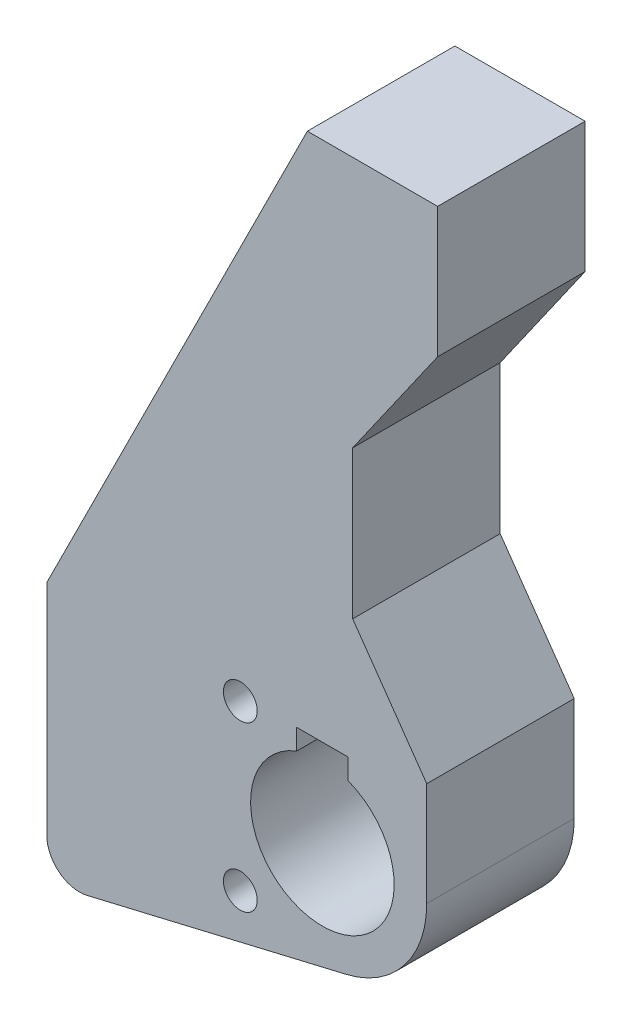
ISO-10303-21;
HEADER;
FILE_DESCRIPTION(('STEP AP214'),'2;1');
FILE_NAME('part.step','',(''),(''),'','','');
FILE_SCHEMA(('AUTOMOTIVE_DESIGN { 1 0 10303 214 1 1 1 1 }'));
ENDSEC;
DATA;
#1=APPLICATION_CONTEXT('core data for automotive mechanical design processes');
#2=APPLICATION_PROTOCOL_DEFINITION('international standard','automotive_design',2000,#1);
#3=PRODUCT_CONTEXT('',#1,'mechanical');
#4=PRODUCT('Part','Part','',(#3));
#5=PRODUCT_RELATED_PRODUCT_CATEGORY('part','',(#4));
#6=PRODUCT_DEFINITION_FORMATION('','',#4);
#7=PRODUCT_DEFINITION_CONTEXT('part definition',#1,'design');
#8=PRODUCT_DEFINITION('design','',#6,#7);
#9=PRODUCT_DEFINITION_SHAPE('','',#8);
#10=(LENGTH_UNIT() NAMED_UNIT(*) SI_UNIT(.MILLI.,.METRE.));
#11=(NAMED_UNIT(*) PLANE_ANGLE_UNIT() SI_UNIT($,.RADIAN.));
#12=(NAMED_UNIT(*) SI_UNIT($,.STERADIAN.) SOLID_ANGLE_UNIT());
#13=UNCERTAINTY_MEASURE_WITH_UNIT(LENGTH_MEASURE(1.E-05),#10,'distance_accuracy_value','');
#14=(GEOMETRIC_REPRESENTATION_CONTEXT(3) GLOBAL_UNCERTAINTY_ASSIGNED_CONTEXT((#13)) GLOBAL_UNIT_ASSIGNED_CONTEXT((#10,
#11,#12)) REPRESENTATION_CONTEXT('',''));
#15=CARTESIAN_POINT('',(0.,0.,0.));
#16=DIRECTION('',(0.,0.,1.));
#17=DIRECTION('',(1.,0.,0.));
#18=AXIS2_PLACEMENT_3D('',#15,#16,#17);
#19=CARTESIAN_POINT('',(3.20727479697018,2.24575798994857,7.1906257));
#20=DIRECTION('',(0.819152044288988,0.573576436351051,0.));
#21=DIRECTION('',(-0.573576436351051,0.819152044288988,0.));
#22=AXIS2_PLACEMENT_3D('',#19,#20,#21);
#23=PLANE('',#22);
#24=DIRECTION('',(0.573576436351051,-0.819152044288988,0.));
#25=VECTOR('',#24,1.);
#26=CARTESIAN_POINT('',(3.20727479697018,2.24575798994857,7.1906257));
#27=LINE('',#26,#25);
#28=CARTESIAN_POINT('',(-21.2885718110109,37.2294524965969,7.1906257));
#29=VERTEX_POINT('',#28);
#30=CARTESIAN_POINT('',(-14.068,26.9174072571635,7.1906257));
#31=VERTEX_POINT('',#30);
#32=EDGE_CURVE('E213',#29,#31,#27,.T.);
#33=ORIENTED_EDGE('',*,*,#32,.T.);
#34=DIRECTION('',(0.,0.,1.));
#35=VECTOR('',#34,1.);
#36=CARTESIAN_POINT('',(-14.068,26.9174072571635,-7.1906257));
#37=LINE('',#36,#35);
#38=CARTESIAN_POINT('',(-14.068,26.9174072571635,-7.1906257));
#39=VERTEX_POINT('',#38);
#40=EDGE_CURVE('E187',#39,#31,#37,.T.);
#41=ORIENTED_EDGE('',*,*,#40,.F.);
#42=DIRECTION('',(0.573576436351051,-0.819152044288988,0.));
#43=VECTOR('',#42,1.);
#44=CARTESIAN_POINT('',(3.20727479697018,2.24575798994857,-7.1906257));
#45=LINE('',#44,#43);
#46=CARTESIAN_POINT('',(-21.2885718110109,37.2294524965969,-7.1906257));
#47=VERTEX_POINT('',#46);
#48=EDGE_CURVE('E249',#47,#39,#45,.T.);
#49=ORIENTED_EDGE('',*,*,#48,.F.);
#50=DIRECTION('',(0.,0.,-1.));
#51=VECTOR('',#50,1.);
#52=CARTESIAN_POINT('',(-21.2885718110109,37.2294524965969,7.1906257));
#53=LINE('',#52,#51);
#54=EDGE_CURVE('E282',#29,#47,#53,.T.);
#55=ORIENTED_EDGE('',*,*,#54,.F.);
#56=EDGE_LOOP('',(#33,#41,#49,#55));
#57=FACE_BOUND('',#56,.T.);
#58=ADVANCED_FACE('F71',(#57),#23,.T.);
#59=CARTESIAN_POINT('',(0.,0.,-7.1906257));
#60=DIRECTION('',(0.,0.,1.));
#61=DIRECTION('',(1.,0.,0.));
#62=AXIS2_PLACEMENT_3D('',#59,#60,#61);
#63=PLANE('',#62);
#64=DIRECTION('',(0.,-1.,0.));
#65=VECTOR('',#64,1.);
#66=CARTESIAN_POINT('',(-21.743,0.,-7.1906257));
#67=LINE('',#66,#65);
#68=CARTESIAN_POINT('',(-21.743,25.338348415311,-7.1906257));
#69=VERTEX_POINT('',#68);
#70=CARTESIAN_POINT('',(-21.743,23.338348415311,-7.1906257));
#71=VERTEX_POINT('',#70);
#72=EDGE_CURVE('E268',#69,#71,#67,.T.);
#73=ORIENTED_EDGE('',*,*,#72,.F.);
#74=DIRECTION('',(-1.,0.,0.));
#75=VECTOR('',#74,1.);
#76=CARTESIAN_POINT('',(0.,25.338348415311,-7.1906257));
#77=LINE('',#76,#75);
#78=CARTESIAN_POINT('',(-26.743,25.338348415311,-7.1906257));
#79=VERTEX_POINT('',#78);
#80=EDGE_CURVE('E210',#69,#79,#77,.T.);
#81=ORIENTED_EDGE('',*,*,#80,.T.);
#82=DIRECTION('',(0.,-1.,0.));
#83=VECTOR('',#82,1.);
#84=CARTESIAN_POINT('',(-26.743,0.,-7.1906257));
#85=LINE('',#84,#83);
#86=CARTESIAN_POINT('',(-26.743,23.338348415311,-7.1906257));
#87=VERTEX_POINT('',#86);
#88=EDGE_CURVE('E274',#79,#87,#85,.T.);
#89=ORIENTED_EDGE('',*,*,#88,.T.);
#90=CARTESIAN_POINT('',(-24.243,16.8,-7.1906257));
#91=DIRECTION('',(0.,0.,1.));
#92=DIRECTION('',(1.,0.,0.));
#93=AXIS2_PLACEMENT_3D('',#90,#91,#92);
#94=CIRCLE('',#93,7.);
#95=EDGE_CURVE('E271',#71,#87,#94,.F.);
#96=ORIENTED_EDGE('',*,*,#95,.F.);
#97=EDGE_LOOP('',(#73,#81,#89,#96));
#98=FACE_BOUND('',#97,.T.);
#99=CARTESIAN_POINT('',(-32.243,8.80000000000001,-7.1906257));
#100=DIRECTION('',(0.,0.,1.));
#101=DIRECTION('',(1.,0.,0.));
#102=AXIS2_PLACEMENT_3D('',#99,#100,#101);
#103=CIRCLE('',#102,1.65);
#104=CARTESIAN_POINT('',(-33.893,8.80000000000001,-7.1906257));
#105=VERTEX_POINT('',#104);
#106=EDGE_CURVE('E246',#105,#105,#103,.T.);
#107=ORIENTED_EDGE('',*,*,#106,.T.);
#108=EDGE_LOOP('',(#107));
#109=FACE_BOUND('',#108,.T.);
#110=CARTESIAN_POINT('',(-32.243,24.8,-7.1906257));
#111=DIRECTION('',(0.,0.,1.));
#112=DIRECTION('',(1.,0.,0.));
#113=AXIS2_PLACEMENT_3D('',#110,#111,#112);
#114=CIRCLE('',#113,1.65);
#115=CARTESIAN_POINT('',(-33.893,24.8,-7.1906257));
#116=VERTEX_POINT('',#115);
#117=EDGE_CURVE('E204',#116,#116,#114,.F.);
#118=ORIENTED_EDGE('',*,*,#117,.F.);
#119=EDGE_LOOP('',(#118));
#120=FACE_BOUND('',#119,.T.);
#121=DIRECTION('',(-0.973219537638035,-0.229877644758268,0.));
#122=VECTOR('',#121,1.);
#123=CARTESIAN_POINT('',(-2.70060532321958,11.4333947816909,-7.1906257));
#124=LINE('',#123,#122);
#125=CARTESIAN_POINT('',(-21.9039949645846,6.897491204533,-7.1906257));
#126=VERTEX_POINT('',#125);
#127=CARTESIAN_POINT('',(-47.2006384778925,0.922341090672931,-7.1906257));
#128=VERTEX_POINT('',#127);
#129=EDGE_CURVE('E191',#126,#128,#124,.T.);
#130=ORIENTED_EDGE('',*,*,#129,.T.);
#131=CARTESIAN_POINT('',(-47.9305,4.01231312267369,-7.1906257));
#132=DIRECTION('',(0.,0.,1.));
#133=DIRECTION('',(1.,0.,0.));
#134=AXIS2_PLACEMENT_3D('',#131,#132,#133);
#135=CIRCLE('',#134,3.175);
#136=CARTESIAN_POINT('',(-51.1055,4.01231312267369,-7.1906257));
#137=VERTEX_POINT('',#136);
#138=EDGE_CURVE('E93',#128,#137,#135,.F.);
#139=ORIENTED_EDGE('',*,*,#138,.T.);
#140=DIRECTION('',(0.,1.,0.));
#141=VECTOR('',#140,1.);
#142=CARTESIAN_POINT('',(-51.1055,0.,-7.1906257));
#143=LINE('',#142,#141);
#144=CARTESIAN_POINT('',(-51.1055,25.4,-7.1906257));
#145=VERTEX_POINT('',#144);
#146=EDGE_CURVE('E266',#137,#145,#143,.T.);
#147=ORIENTED_EDGE('',*,*,#146,.T.);
#148=DIRECTION('',(0.447213595499958,0.894427190999916,0.));
#149=VECTOR('',#148,1.);
#150=CARTESIAN_POINT('',(-51.0444,25.5222,-7.1906257));
#151=LINE('',#150,#149);
#152=CARTESIAN_POINT('',(-25.7055,76.2,-7.1906257));
#153=VERTEX_POINT('',#152);
#154=EDGE_CURVE('E263',#145,#153,#151,.T.);
#155=ORIENTED_EDGE('',*,*,#154,.T.);
#156=DIRECTION('',(1.,0.,0.));
#157=VECTOR('',#156,1.);
#158=CARTESIAN_POINT('',(0.,76.2,-7.1906257));
#159=LINE('',#158,#157);
#160=CARTESIAN_POINT('',(-13.0055,76.2,-7.1906257));
#161=VERTEX_POINT('',#160);
#162=EDGE_CURVE('E260',#153,#161,#159,.T.);
#163=ORIENTED_EDGE('',*,*,#162,.T.);
#164=DIRECTION('',(0.,-1.,0.));
#165=VECTOR('',#164,1.);
#166=CARTESIAN_POINT('',(-13.0055000000001,0.,-7.1906257));
#167=LINE('',#166,#165);
#168=CARTESIAN_POINT('',(-13.0055,63.5,-7.1906257));
#169=VERTEX_POINT('',#168);
#170=EDGE_CURVE('E257',#161,#169,#167,.T.);
#171=ORIENTED_EDGE('',*,*,#170,.T.);
#172=DIRECTION('',(-0.573576436351047,-0.819152044288991,0.));
#173=VECTOR('',#172,1.);
#174=CARTESIAN_POINT('',(-38.5620621969636,27.0014466392257,-7.1906257));
#175=LINE('',#174,#173);
#176=CARTESIAN_POINT('',(-21.2885718110109,51.6705475034031,-7.1906257));
#177=VERTEX_POINT('',#176);
#178=EDGE_CURVE('E254',#169,#177,#175,.T.);
#179=ORIENTED_EDGE('',*,*,#178,.T.);
#180=DIRECTION('',(0.,-1.,0.));
#181=VECTOR('',#180,1.);
#182=CARTESIAN_POINT('',(-21.2885718110109,0.,-7.1906257));
#183=LINE('',#182,#181);
#184=EDGE_CURVE('E251',#177,#47,#183,.T.);
#185=ORIENTED_EDGE('',*,*,#184,.T.);
#186=ORIENTED_EDGE('',*,*,#48,.T.);
#187=DIRECTION('',(0.,1.,0.));
#188=VECTOR('',#187,1.);
#189=CARTESIAN_POINT('',(-14.068,0.,-7.1906257));
#190=LINE('',#189,#188);
#191=CARTESIAN_POINT('',(-14.068,16.8,-7.1906257));
#192=VERTEX_POINT('',#191);
#193=EDGE_CURVE('E188',#192,#39,#190,.T.);
#194=ORIENTED_EDGE('',*,*,#193,.F.);
#195=CARTESIAN_POINT('',(-24.243,16.8,-7.1906257));
#196=DIRECTION('',(0.,0.,1.));
#197=DIRECTION('',(1.,0.,0.));
#198=AXIS2_PLACEMENT_3D('',#195,#196,#197);
#199=CIRCLE('',#198,10.175);
#200=EDGE_CURVE('E180',#126,#192,#199,.T.);
#201=ORIENTED_EDGE('',*,*,#200,.F.);
#202=EDGE_LOOP('',(#130,#139,#147,#155,#163,#171,#179,#185,#186,#194,#201));
#203=FACE_BOUND('',#202,.T.);
#204=ADVANCED_FACE('F197',(#98,#109,#120,#203),#63,.F.);
#205=CARTESIAN_POINT('',(0.,0.,7.1906257));
#206=DIRECTION('',(0.,0.,1.));
#207=DIRECTION('',(1.,0.,0.));
#208=AXIS2_PLACEMENT_3D('',#205,#206,#207);
#209=PLANE('',#208);
#210=CARTESIAN_POINT('',(-32.243,24.8,7.1906257));
#211=DIRECTION('',(0.,0.,1.));
#212=DIRECTION('',(1.,0.,0.));
#213=AXIS2_PLACEMENT_3D('',#210,#211,#212);
#214=CIRCLE('',#213,1.65);
#215=CARTESIAN_POINT('',(-33.893,24.8,7.1906257));
#216=VERTEX_POINT('',#215);
#217=EDGE_CURVE('E206',#216,#216,#214,.F.);
#218=ORIENTED_EDGE('',*,*,#217,.T.);
#219=EDGE_LOOP('',(#218));
#220=FACE_BOUND('',#219,.T.);
#221=CARTESIAN_POINT('',(-32.243,8.80000000000001,7.1906257));
#222=DIRECTION('',(0.,0.,1.));
#223=DIRECTION('',(1.,0.,0.));
#224=AXIS2_PLACEMENT_3D('',#221,#222,#223);
#225=CIRCLE('',#224,1.65);
#226=CARTESIAN_POINT('',(-33.893,8.80000000000001,7.1906257));
#227=VERTEX_POINT('',#226);
#228=EDGE_CURVE('E209',#227,#227,#225,.T.);
#229=ORIENTED_EDGE('',*,*,#228,.F.);
#230=EDGE_LOOP('',(#229));
#231=FACE_BOUND('',#230,.T.);
#232=DIRECTION('',(0.,-1.,0.));
#233=VECTOR('',#232,1.);
#234=CARTESIAN_POINT('',(-21.743,0.,7.1906257));
#235=LINE('',#234,#233);
#236=CARTESIAN_POINT('',(-21.743,25.338348415311,7.1906257));
#237=VERTEX_POINT('',#236);
#238=CARTESIAN_POINT('',(-21.743,23.338348415311,7.1906257));
#239=VERTEX_POINT('',#238);
#240=EDGE_CURVE('E232',#237,#239,#235,.T.);
#241=ORIENTED_EDGE('',*,*,#240,.T.);
#242=CARTESIAN_POINT('',(-24.243,16.8,7.1906257));
#243=DIRECTION('',(0.,0.,1.));
#244=DIRECTION('',(1.,0.,0.));
#245=AXIS2_PLACEMENT_3D('',#242,#243,#244);
#246=CIRCLE('',#245,7.);
#247=CARTESIAN_POINT('',(-26.743,23.338348415311,7.1906257));
#248=VERTEX_POINT('',#247);
#249=EDGE_CURVE('E235',#239,#248,#246,.F.);
#250=ORIENTED_EDGE('',*,*,#249,.T.);
#251=DIRECTION('',(0.,-1.,0.));
#252=VECTOR('',#251,1.);
#253=CARTESIAN_POINT('',(-26.743,0.,7.1906257));
#254=LINE('',#253,#252);
#255=CARTESIAN_POINT('',(-26.743,25.338348415311,7.1906257));
#256=VERTEX_POINT('',#255);
#257=EDGE_CURVE('E237',#256,#248,#254,.T.);
#258=ORIENTED_EDGE('',*,*,#257,.F.);
#259=DIRECTION('',(-1.,0.,0.));
#260=VECTOR('',#259,1.);
#261=CARTESIAN_POINT('',(0.,25.338348415311,7.1906257));
#262=LINE('',#261,#260);
#263=EDGE_CURVE('E240',#237,#256,#262,.T.);
#264=ORIENTED_EDGE('',*,*,#263,.F.);
#265=EDGE_LOOP('',(#241,#250,#258,#264));
#266=FACE_BOUND('',#265,.T.);
#267=DIRECTION('',(0.,1.,0.));
#268=VECTOR('',#267,1.);
#269=CARTESIAN_POINT('',(-51.1055,0.,7.1906257));
#270=LINE('',#269,#268);
#271=CARTESIAN_POINT('',(-51.1055,4.01231312267369,7.1906257));
#272=VERTEX_POINT('',#271);
#273=CARTESIAN_POINT('',(-51.1055,25.4,7.1906257));
#274=VERTEX_POINT('',#273);
#275=EDGE_CURVE('E231',#272,#274,#270,.T.);
#276=ORIENTED_EDGE('',*,*,#275,.F.);
#277=CARTESIAN_POINT('',(-47.9305,4.01231312267369,7.1906257));
#278=DIRECTION('',(0.,0.,1.));
#279=DIRECTION('',(1.,0.,0.));
#280=AXIS2_PLACEMENT_3D('',#277,#278,#279);
#281=CIRCLE('',#280,3.175);
#282=CARTESIAN_POINT('',(-47.2006384778925,0.922341090672931,7.1906257));
#283=VERTEX_POINT('',#282);
#284=EDGE_CURVE('E12',#272,#283,#281,.T.);
#285=ORIENTED_EDGE('',*,*,#284,.T.);
#286=DIRECTION('',(-0.973219537638035,-0.229877644758268,0.));
#287=VECTOR('',#286,1.);
#288=CARTESIAN_POINT('',(-2.70060532321958,11.4333947816909,7.1906257));
#289=LINE('',#288,#287);
#290=CARTESIAN_POINT('',(-21.9039949645846,6.897491204533,7.1906257));
#291=VERTEX_POINT('',#290);
#292=EDGE_CURVE('E289',#291,#283,#289,.T.);
#293=ORIENTED_EDGE('',*,*,#292,.F.);
#294=CARTESIAN_POINT('',(-24.243,16.8,7.1906257));
#295=DIRECTION('',(0.,0.,1.));
#296=DIRECTION('',(1.,0.,0.));
#297=AXIS2_PLACEMENT_3D('',#294,#295,#296);
#298=CIRCLE('',#297,10.175);
#299=CARTESIAN_POINT('',(-14.068,16.8,7.1906257));
#300=VERTEX_POINT('',#299);
#301=EDGE_CURVE('E183',#291,#300,#298,.T.);
#302=ORIENTED_EDGE('',*,*,#301,.T.);
#303=DIRECTION('',(0.,1.,0.));
#304=VECTOR('',#303,1.);
#305=CARTESIAN_POINT('',(-14.068,0.,7.1906257));
#306=LINE('',#305,#304);
#307=EDGE_CURVE('E301',#300,#31,#306,.T.);
#308=ORIENTED_EDGE('',*,*,#307,.T.);
#309=ORIENTED_EDGE('',*,*,#32,.F.);
#310=DIRECTION('',(0.,-1.,0.));
#311=VECTOR('',#310,1.);
#312=CARTESIAN_POINT('',(-21.2885718110109,0.,7.1906257));
#313=LINE('',#312,#311);
#314=CARTESIAN_POINT('',(-21.2885718110109,51.6705475034031,7.1906257));
#315=VERTEX_POINT('',#314);
#316=EDGE_CURVE('E216',#315,#29,#313,.T.);
#317=ORIENTED_EDGE('',*,*,#316,.F.);
#318=DIRECTION('',(-0.573576436351047,-0.819152044288991,0.));
#319=VECTOR('',#318,1.);
#320=CARTESIAN_POINT('',(-38.5620621969636,27.0014466392257,7.1906257));
#321=LINE('',#320,#319);
#322=CARTESIAN_POINT('',(-13.0055,63.5,7.1906257));
#323=VERTEX_POINT('',#322);
#324=EDGE_CURVE('E219',#323,#315,#321,.T.);
#325=ORIENTED_EDGE('',*,*,#324,.F.);
#326=DIRECTION('',(0.,-1.,0.));
#327=VECTOR('',#326,1.);
#328=CARTESIAN_POINT('',(-13.0055000000001,0.,7.1906257));
#329=LINE('',#328,#327);
#330=CARTESIAN_POINT('',(-13.0055,76.2,7.1906257));
#331=VERTEX_POINT('',#330);
#332=EDGE_CURVE('E222',#331,#323,#329,.T.);
#333=ORIENTED_EDGE('',*,*,#332,.F.);
#334=DIRECTION('',(1.,0.,0.));
#335=VECTOR('',#334,1.);
#336=CARTESIAN_POINT('',(0.,76.2,7.1906257));
#337=LINE('',#336,#335);
#338=CARTESIAN_POINT('',(-25.7055,76.2,7.1906257));
#339=VERTEX_POINT('',#338);
#340=EDGE_CURVE('E225',#339,#331,#337,.T.);
#341=ORIENTED_EDGE('',*,*,#340,.F.);
#342=DIRECTION('',(0.447213595499958,0.894427190999916,0.));
#343=VECTOR('',#342,1.);
#344=CARTESIAN_POINT('',(-51.0444,25.5222,7.1906257));
#345=LINE('',#344,#343);
#346=EDGE_CURVE('E228',#274,#339,#345,.T.);
#347=ORIENTED_EDGE('',*,*,#346,.F.);
#348=EDGE_LOOP('',(#276,#285,#293,#302,#308,#309,#317,#325,#333,#341,#347));
#349=FACE_BOUND('',#348,.T.);
#350=ADVANCED_FACE('F309',(#220,#231,#266,#349),#209,.T.);
#351=CARTESIAN_POINT('',(-24.243,16.8,7.1906257));
#352=DIRECTION('',(0.,0.,-1.));
#353=DIRECTION('',(-1.,0.,0.));
#354=AXIS2_PLACEMENT_3D('',#351,#352,#353);
#355=CYLINDRICAL_SURFACE('',#354,7.);
#356=ORIENTED_EDGE('',*,*,#95,.T.);
#357=DIRECTION('',(0.,0.,-1.));
#358=VECTOR('',#357,1.);
#359=CARTESIAN_POINT('',(-26.743,23.338348415311,7.1906257));
#360=LINE('',#359,#358);
#361=EDGE_CURVE('E284',#248,#87,#360,.T.);
#362=ORIENTED_EDGE('',*,*,#361,.F.);
#363=ORIENTED_EDGE('',*,*,#249,.F.);
#364=DIRECTION('',(0.,0.,-1.));
#365=VECTOR('',#364,1.);
#366=CARTESIAN_POINT('',(-21.743,23.338348415311,7.1906257));
#367=LINE('',#366,#365);
#368=EDGE_CURVE('E286',#239,#71,#367,.T.);
#369=ORIENTED_EDGE('',*,*,#368,.T.);
#370=EDGE_LOOP('',(#356,#362,#363,#369));
#371=FACE_BOUND('',#370,.T.);
#372=ADVANCED_FACE('F349',(#371),#355,.F.);
#373=CARTESIAN_POINT('',(-26.743,0.,7.1906257));
#374=DIRECTION('',(1.,0.,0.));
#375=DIRECTION('',(0.,0.,-1.));
#376=AXIS2_PLACEMENT_3D('',#373,#374,#375);
#377=PLANE('',#376);
#378=ORIENTED_EDGE('',*,*,#88,.F.);
#379=DIRECTION('',(0.,0.,-1.));
#380=VECTOR('',#379,1.);
#381=CARTESIAN_POINT('',(-26.743,25.338348415311,7.1906257));
#382=LINE('',#381,#380);
#383=EDGE_CURVE('E281',#256,#79,#382,.T.);
#384=ORIENTED_EDGE('',*,*,#383,.F.);
#385=ORIENTED_EDGE('',*,*,#257,.T.);
#386=ORIENTED_EDGE('',*,*,#361,.T.);
#387=EDGE_LOOP('',(#378,#384,#385,#386));
#388=FACE_BOUND('',#387,.T.);
#389=ADVANCED_FACE('F364',(#388),#377,.T.);
#390=CARTESIAN_POINT('',(0.,25.338348415311,7.1906257));
#391=DIRECTION('',(0.,-1.,0.));
#392=DIRECTION('',(1.,0.,0.));
#393=AXIS2_PLACEMENT_3D('',#390,#391,#392);
#394=PLANE('',#393);
#395=ORIENTED_EDGE('',*,*,#80,.F.);
#396=DIRECTION('',(0.,0.,-1.));
#397=VECTOR('',#396,1.);
#398=CARTESIAN_POINT('',(-21.743,25.338348415311,7.1906257));
#399=LINE('',#398,#397);
#400=EDGE_CURVE('E279',#237,#69,#399,.T.);
#401=ORIENTED_EDGE('',*,*,#400,.F.);
#402=ORIENTED_EDGE('',*,*,#263,.T.);
#403=ORIENTED_EDGE('',*,*,#383,.T.);
#404=EDGE_LOOP('',(#395,#401,#402,#403));
#405=FACE_BOUND('',#404,.T.);
#406=ADVANCED_FACE('F367',(#405),#394,.T.);
#407=CARTESIAN_POINT('',(-21.743,0.,7.1906257));
#408=DIRECTION('',(1.,0.,0.));
#409=DIRECTION('',(0.,0.,-1.));
#410=AXIS2_PLACEMENT_3D('',#407,#408,#409);
#411=PLANE('',#410);
#412=ORIENTED_EDGE('',*,*,#72,.T.);
#413=ORIENTED_EDGE('',*,*,#368,.F.);
#414=ORIENTED_EDGE('',*,*,#240,.F.);
#415=ORIENTED_EDGE('',*,*,#400,.T.);
#416=EDGE_LOOP('',(#412,#413,#414,#415));
#417=FACE_BOUND('',#416,.T.);
#418=ADVANCED_FACE('F359',(#417),#411,.F.);
#419=CARTESIAN_POINT('',(-21.2885718110109,0.,7.1906257));
#420=DIRECTION('',(1.,0.,0.));
#421=DIRECTION('',(0.,1.,0.));
#422=AXIS2_PLACEMENT_3D('',#419,#420,#421);
#423=PLANE('',#422);
#424=ORIENTED_EDGE('',*,*,#184,.F.);
#425=DIRECTION('',(0.,0.,-1.));
#426=VECTOR('',#425,1.);
#427=CARTESIAN_POINT('',(-21.2885718110109,51.6705475034031,7.1906257));
#428=LINE('',#427,#426);
#429=EDGE_CURVE('E298',#315,#177,#428,.T.);
#430=ORIENTED_EDGE('',*,*,#429,.F.);
#431=ORIENTED_EDGE('',*,*,#316,.T.);
#432=ORIENTED_EDGE('',*,*,#54,.T.);
#433=EDGE_LOOP('',(#424,#430,#431,#432));
#434=FACE_BOUND('',#433,.T.);
#435=ADVANCED_FACE('F331',(#434),#423,.T.);
#436=CARTESIAN_POINT('',(-38.5620621969636,27.0014466392257,7.1906257));
#437=DIRECTION('',(0.819152044288991,-0.573576436351047,0.));
#438=DIRECTION('',(0.573576436351047,0.819152044288991,0.));
#439=AXIS2_PLACEMENT_3D('',#436,#437,#438);
#440=PLANE('',#439);
#441=ORIENTED_EDGE('',*,*,#178,.F.);
#442=DIRECTION('',(0.,0.,-1.));
#443=VECTOR('',#442,1.);
#444=CARTESIAN_POINT('',(-13.0055,63.5,7.1906257));
#445=LINE('',#444,#443);
#446=EDGE_CURVE('E296',#323,#169,#445,.T.);
#447=ORIENTED_EDGE('',*,*,#446,.F.);
#448=ORIENTED_EDGE('',*,*,#324,.T.);
#449=ORIENTED_EDGE('',*,*,#429,.T.);
#450=EDGE_LOOP('',(#441,#447,#448,#449));
#451=FACE_BOUND('',#450,.T.);
#452=ADVANCED_FACE('F394',(#451),#440,.T.);
#453=CARTESIAN_POINT('',(-13.0055000000001,0.,7.1906257));
#454=DIRECTION('',(1.,0.,0.));
#455=DIRECTION('',(0.,1.,0.));
#456=AXIS2_PLACEMENT_3D('',#453,#454,#455);
#457=PLANE('',#456);
#458=ORIENTED_EDGE('',*,*,#170,.F.);
#459=DIRECTION('',(0.,0.,-1.));
#460=VECTOR('',#459,1.);
#461=CARTESIAN_POINT('',(-13.0055,76.2,7.1906257));
#462=LINE('',#461,#460);
#463=EDGE_CURVE('E294',#331,#161,#462,.T.);
#464=ORIENTED_EDGE('',*,*,#463,.F.);
#465=ORIENTED_EDGE('',*,*,#332,.T.);
#466=ORIENTED_EDGE('',*,*,#446,.T.);
#467=EDGE_LOOP('',(#458,#464,#465,#466));
#468=FACE_BOUND('',#467,.T.);
#469=ADVANCED_FACE('F391',(#468),#457,.T.);
#470=CARTESIAN_POINT('',(0.,76.2,7.1906257));
#471=DIRECTION('',(0.,1.,0.));
#472=DIRECTION('',(-1.,0.,0.));
#473=AXIS2_PLACEMENT_3D('',#470,#471,#472);
#474=PLANE('',#473);
#475=ORIENTED_EDGE('',*,*,#162,.F.);
#476=DIRECTION('',(0.,0.,-1.));
#477=VECTOR('',#476,1.);
#478=CARTESIAN_POINT('',(-25.7055,76.2,7.1906257));
#479=LINE('',#478,#477);
#480=EDGE_CURVE('E292',#339,#153,#479,.T.);
#481=ORIENTED_EDGE('',*,*,#480,.F.);
#482=ORIENTED_EDGE('',*,*,#340,.T.);
#483=ORIENTED_EDGE('',*,*,#463,.T.);
#484=EDGE_LOOP('',(#475,#481,#482,#483));
#485=FACE_BOUND('',#484,.T.);
#486=ADVANCED_FACE('F387',(#485),#474,.T.);
#487=CARTESIAN_POINT('',(-51.0444,25.5222,7.1906257));
#488=DIRECTION('',(-0.894427190999916,0.447213595499958,0.));
#489=DIRECTION('',(-0.447213595499958,-0.894427190999916,0.));
#490=AXIS2_PLACEMENT_3D('',#487,#488,#489);
#491=PLANE('',#490);
#492=ORIENTED_EDGE('',*,*,#154,.F.);
#493=DIRECTION('',(0.,0.,-1.));
#494=VECTOR('',#493,1.);
#495=CARTESIAN_POINT('',(-51.1055,25.4,7.1906257));
#496=LINE('',#495,#494);
#497=EDGE_CURVE('E243',#274,#145,#496,.T.);
#498=ORIENTED_EDGE('',*,*,#497,.F.);
#499=ORIENTED_EDGE('',*,*,#346,.T.);
#500=ORIENTED_EDGE('',*,*,#480,.T.);
#501=EDGE_LOOP('',(#492,#498,#499,#500));
#502=FACE_BOUND('',#501,.T.);
#503=ADVANCED_FACE('F384',(#502),#491,.T.);
#504=CARTESIAN_POINT('',(-51.1055,0.,7.1906257));
#505=DIRECTION('',(-1.,0.,0.));
#506=DIRECTION('',(0.,0.,1.));
#507=AXIS2_PLACEMENT_3D('',#504,#505,#506);
#508=PLANE('',#507);
#509=ORIENTED_EDGE('',*,*,#146,.F.);
#510=DIRECTION('',(0.,0.,-1.));
#511=VECTOR('',#510,1.);
#512=CARTESIAN_POINT('',(-51.1055,4.01231312267369,7.1906257));
#513=LINE('',#512,#511);
#514=EDGE_CURVE('E79',#137,#272,#513,.F.);
#515=ORIENTED_EDGE('',*,*,#514,.T.);
#516=ORIENTED_EDGE('',*,*,#275,.T.);
#517=ORIENTED_EDGE('',*,*,#497,.T.);
#518=EDGE_LOOP('',(#509,#515,#516,#517));
#519=FACE_BOUND('',#518,.T.);
#520=ADVANCED_FACE('F336',(#519),#508,.T.);
#521=CARTESIAN_POINT('',(-32.243,8.80000000000001,7.1906257));
#522=DIRECTION('',(0.,0.,-1.));
#523=DIRECTION('',(-1.,0.,0.));
#524=AXIS2_PLACEMENT_3D('',#521,#522,#523);
#525=CYLINDRICAL_SURFACE('',#524,1.65);
#526=CARTESIAN_POINT('',(-33.893,8.80000000000001,7.1906257));
#527=CARTESIAN_POINT('',(-33.893,8.80000000000001,7.04082099791667));
#528=CARTESIAN_POINT('',(-33.893,8.80000000000001,6.89101629583333));
#529=CARTESIAN_POINT('',(-33.893,8.80000000000001,6.59140689166667));
#530=CARTESIAN_POINT('',(-33.893,8.80000000000001,6.44160218958333));
#531=CARTESIAN_POINT('',(-33.893,8.80000000000001,6.14199278541667));
#532=CARTESIAN_POINT('',(-33.893,8.80000000000001,5.99218808333333));
#533=CARTESIAN_POINT('',(-33.893,8.80000000000001,5.69257867916667));
#534=CARTESIAN_POINT('',(-33.893,8.80000000000001,5.54277397708333));
#535=CARTESIAN_POINT('',(-33.893,8.80000000000001,5.24316457291667));
#536=CARTESIAN_POINT('',(-33.893,8.80000000000001,5.09335987083333));
#537=CARTESIAN_POINT('',(-33.893,8.80000000000001,4.79375046666667));
#538=CARTESIAN_POINT('',(-33.893,8.80000000000001,4.64394576458333));
#539=CARTESIAN_POINT('',(-33.893,8.80000000000001,4.34433636041667));
#540=CARTESIAN_POINT('',(-33.893,8.80000000000001,4.19453165833333));
#541=CARTESIAN_POINT('',(-33.893,8.80000000000001,3.89492225416667));
#542=CARTESIAN_POINT('',(-33.893,8.80000000000001,3.74511755208333));
#543=CARTESIAN_POINT('',(-33.893,8.80000000000001,3.44550814791667));
#544=CARTESIAN_POINT('',(-33.893,8.80000000000001,3.29570344583333));
#545=CARTESIAN_POINT('',(-33.893,8.80000000000001,2.99609404166667));
#546=CARTESIAN_POINT('',(-33.893,8.80000000000001,2.84628933958333));
#547=CARTESIAN_POINT('',(-33.893,8.80000000000001,2.54667993541667));
#548=CARTESIAN_POINT('',(-33.893,8.80000000000001,2.39687523333333));
#549=CARTESIAN_POINT('',(-33.893,8.80000000000001,2.09726582916667));
#550=CARTESIAN_POINT('',(-33.893,8.80000000000001,1.94746112708333));
#551=CARTESIAN_POINT('',(-33.893,8.80000000000001,1.64785172291667));
#552=CARTESIAN_POINT('',(-33.893,8.80000000000001,1.49804702083333));
#553=CARTESIAN_POINT('',(-33.893,8.80000000000001,1.19843761666666));
#554=CARTESIAN_POINT('',(-33.893,8.80000000000001,1.04863291458333));
#555=CARTESIAN_POINT('',(-33.893,8.80000000000001,0.749023510416665));
#556=CARTESIAN_POINT('',(-33.893,8.80000000000001,0.599218808333332));
#557=CARTESIAN_POINT('',(-33.893,8.80000000000001,0.299609404166665));
#558=CARTESIAN_POINT('',(-33.893,8.80000000000001,0.149804702083332));
#559=CARTESIAN_POINT('',(-33.893,8.80000000000001,-0.149804702083335));
#560=CARTESIAN_POINT('',(-33.893,8.80000000000001,-0.299609404166669));
#561=CARTESIAN_POINT('',(-33.893,8.80000000000001,-0.599218808333335));
#562=CARTESIAN_POINT('',(-33.893,8.80000000000001,-0.749023510416668));
#563=CARTESIAN_POINT('',(-33.893,8.80000000000001,-1.04863291458333));
#564=CARTESIAN_POINT('',(-33.893,8.80000000000001,-1.19843761666667));
#565=CARTESIAN_POINT('',(-33.893,8.80000000000001,-1.49804702083333));
#566=CARTESIAN_POINT('',(-33.893,8.80000000000001,-1.64785172291667));
#567=CARTESIAN_POINT('',(-33.893,8.80000000000001,-1.94746112708333));
#568=CARTESIAN_POINT('',(-33.893,8.80000000000001,-2.09726582916667));
#569=CARTESIAN_POINT('',(-33.893,8.80000000000001,-2.39687523333333));
#570=CARTESIAN_POINT('',(-33.893,8.80000000000001,-2.54667993541667));
#571=CARTESIAN_POINT('',(-33.893,8.80000000000001,-2.84628933958333));
#572=CARTESIAN_POINT('',(-33.893,8.80000000000001,-2.99609404166667));
#573=CARTESIAN_POINT('',(-33.893,8.80000000000001,-3.29570344583333));
#574=CARTESIAN_POINT('',(-33.893,8.80000000000001,-3.44550814791667));
#575=CARTESIAN_POINT('',(-33.893,8.80000000000001,-3.74511755208333));
#576=CARTESIAN_POINT('',(-33.893,8.80000000000001,-3.89492225416667));
#577=CARTESIAN_POINT('',(-33.893,8.80000000000001,-4.19453165833333));
#578=CARTESIAN_POINT('',(-33.893,8.80000000000001,-4.34433636041667));
#579=CARTESIAN_POINT('',(-33.893,8.80000000000001,-4.64394576458333));
#580=CARTESIAN_POINT('',(-33.893,8.80000000000001,-4.79375046666667));
#581=CARTESIAN_POINT('',(-33.893,8.80000000000001,-5.09335987083333));
#582=CARTESIAN_POINT('',(-33.893,8.80000000000001,-5.24316457291667));
#583=CARTESIAN_POINT('',(-33.893,8.80000000000001,-5.54277397708333));
#584=CARTESIAN_POINT('',(-33.893,8.80000000000001,-5.69257867916667));
#585=CARTESIAN_POINT('',(-33.893,8.80000000000001,-5.99218808333333));
#586=CARTESIAN_POINT('',(-33.893,8.80000000000001,-6.14199278541667));
#587=CARTESIAN_POINT('',(-33.893,8.80000000000001,-6.44160218958333));
#588=CARTESIAN_POINT('',(-33.893,8.80000000000001,-6.59140689166667));
#589=CARTESIAN_POINT('',(-33.893,8.80000000000001,-6.89101629583333));
#590=CARTESIAN_POINT('',(-33.893,8.80000000000001,-7.04082099791667));
#591=CARTESIAN_POINT('',(-33.893,8.80000000000001,-7.1906257));
#592=B_SPLINE_CURVE_WITH_KNOTS('',3,(#526,#527,#528,#529,#530,#531,#532,#533,#534,#535,#536,
#537,#538,#539,#540,#541,#542,#543,#544,#545,#546,#547,#548,#549,#550,#551,#552,#553,#554,#555,
#556,#557,#558,#559,#560,#561,#562,#563,#564,#565,#566,#567,#568,#569,#570,#571,#572,#573,#574,
#575,#576,#577,#578,#579,#580,#581,#582,#583,#584,#585,#586,#587,#588,#589,#590,#591),
.UNSPECIFIED.,.F.,.F.,(4,2,2,2,2,2,2,2,2,2,2,2,2,2,2,2,2,2,2,2,2,2,2,2,2,2,2,2,2,2,2,2,4),(0.,
0.44941410625,0.898828212499999,1.34824231875,1.797656425,2.24707053125,2.6964846375,
3.14589874375,3.59531285,4.04472695625,4.4941410625,4.94355516875,5.392969275,5.84238338125,
6.2917974875,6.74121159375,7.1906257,7.64003980625,8.0894539125,8.53886801875,8.988282125,
9.43769623125,9.8871103375,10.33652444375,10.78593855,11.23535265625,11.6847667625,
12.13418086875,12.583594975,13.03300908125,13.4824231875,13.93183729375,14.3812514),.UNSPECIFIED.);
#593=EDGE_CURVE('BSEAM333',#227,#105,#592,.T.);
#594=ORIENTED_EDGE('',*,*,#228,.T.);
#595=ORIENTED_EDGE('',*,*,#106,.F.);
#596=ORIENTED_EDGE('',*,*,#593,.T.);
#597=ORIENTED_EDGE('',*,*,#593,.F.);
#598=EDGE_LOOP('',(#594,#596,#595,#597));
#599=FACE_BOUND('',#598,.T.);
#600=ADVANCED_FACE('F333',(#599),#525,.F.);
#601=CARTESIAN_POINT('',(-32.243,24.8,7.1906257));
#602=DIRECTION('',(0.,0.,-1.));
#603=DIRECTION('',(-1.,0.,0.));
#604=AXIS2_PLACEMENT_3D('',#601,#602,#603);
#605=CYLINDRICAL_SURFACE('',#604,1.65);
#606=CARTESIAN_POINT('',(-33.893,24.8,7.1906257));
#607=CARTESIAN_POINT('',(-33.893,24.8,7.04082099791667));
#608=CARTESIAN_POINT('',(-33.893,24.8,6.89101629583333));
#609=CARTESIAN_POINT('',(-33.893,24.8,6.59140689166667));
#610=CARTESIAN_POINT('',(-33.893,24.8,6.44160218958333));
#611=CARTESIAN_POINT('',(-33.893,24.8,6.14199278541667));
#612=CARTESIAN_POINT('',(-33.893,24.8,5.99218808333333));
#613=CARTESIAN_POINT('',(-33.893,24.8,5.69257867916667));
#614=CARTESIAN_POINT('',(-33.893,24.8,5.54277397708333));
#615=CARTESIAN_POINT('',(-33.893,24.8,5.24316457291667));
#616=CARTESIAN_POINT('',(-33.893,24.8,5.09335987083333));
#617=CARTESIAN_POINT('',(-33.893,24.8,4.79375046666667));
#618=CARTESIAN_POINT('',(-33.893,24.8,4.64394576458333));
#619=CARTESIAN_POINT('',(-33.893,24.8,4.34433636041667));
#620=CARTESIAN_POINT('',(-33.893,24.8,4.19453165833333));
#621=CARTESIAN_POINT('',(-33.893,24.8,3.89492225416667));
#622=CARTESIAN_POINT('',(-33.893,24.8,3.74511755208333));
#623=CARTESIAN_POINT('',(-33.893,24.8,3.44550814791667));
#624=CARTESIAN_POINT('',(-33.893,24.8,3.29570344583333));
#625=CARTESIAN_POINT('',(-33.893,24.8,2.99609404166667));
#626=CARTESIAN_POINT('',(-33.893,24.8,2.84628933958333));
#627=CARTESIAN_POINT('',(-33.893,24.8,2.54667993541667));
#628=CARTESIAN_POINT('',(-33.893,24.8,2.39687523333333));
#629=CARTESIAN_POINT('',(-33.893,24.8,2.09726582916667));
#630=CARTESIAN_POINT('',(-33.893,24.8,1.94746112708333));
#631=CARTESIAN_POINT('',(-33.893,24.8,1.64785172291667));
#632=CARTESIAN_POINT('',(-33.893,24.8,1.49804702083333));
#633=CARTESIAN_POINT('',(-33.893,24.8,1.19843761666666));
#634=CARTESIAN_POINT('',(-33.893,24.8,1.04863291458333));
#635=CARTESIAN_POINT('',(-33.893,24.8,0.749023510416665));
#636=CARTESIAN_POINT('',(-33.893,24.8,0.599218808333332));
#637=CARTESIAN_POINT('',(-33.893,24.8,0.299609404166665));
#638=CARTESIAN_POINT('',(-33.893,24.8,0.149804702083332));
#639=CARTESIAN_POINT('',(-33.893,24.8,-0.149804702083335));
#640=CARTESIAN_POINT('',(-33.893,24.8,-0.299609404166669));
#641=CARTESIAN_POINT('',(-33.893,24.8,-0.599218808333335));
#642=CARTESIAN_POINT('',(-33.893,24.8,-0.749023510416668));
#643=CARTESIAN_POINT('',(-33.893,24.8,-1.04863291458333));
#644=CARTESIAN_POINT('',(-33.893,24.8,-1.19843761666667));
#645=CARTESIAN_POINT('',(-33.893,24.8,-1.49804702083333));
#646=CARTESIAN_POINT('',(-33.893,24.8,-1.64785172291667));
#647=CARTESIAN_POINT('',(-33.893,24.8,-1.94746112708333));
#648=CARTESIAN_POINT('',(-33.893,24.8,-2.09726582916667));
#649=CARTESIAN_POINT('',(-33.893,24.8,-2.39687523333333));
#650=CARTESIAN_POINT('',(-33.893,24.8,-2.54667993541667));
#651=CARTESIAN_POINT('',(-33.893,24.8,-2.84628933958333));
#652=CARTESIAN_POINT('',(-33.893,24.8,-2.99609404166667));
#653=CARTESIAN_POINT('',(-33.893,24.8,-3.29570344583333));
#654=CARTESIAN_POINT('',(-33.893,24.8,-3.44550814791667));
#655=CARTESIAN_POINT('',(-33.893,24.8,-3.74511755208333));
#656=CARTESIAN_POINT('',(-33.893,24.8,-3.89492225416667));
#657=CARTESIAN_POINT('',(-33.893,24.8,-4.19453165833333));
#658=CARTESIAN_POINT('',(-33.893,24.8,-4.34433636041667));
#659=CARTESIAN_POINT('',(-33.893,24.8,-4.64394576458333));
#660=CARTESIAN_POINT('',(-33.893,24.8,-4.79375046666667));
#661=CARTESIAN_POINT('',(-33.893,24.8,-5.09335987083333));
#662=CARTESIAN_POINT('',(-33.893,24.8,-5.24316457291667));
#663=CARTESIAN_POINT('',(-33.893,24.8,-5.54277397708333));
#664=CARTESIAN_POINT('',(-33.893,24.8,-5.69257867916667));
#665=CARTESIAN_POINT('',(-33.893,24.8,-5.99218808333333));
#666=CARTESIAN_POINT('',(-33.893,24.8,-6.14199278541667));
#667=CARTESIAN_POINT('',(-33.893,24.8,-6.44160218958333));
#668=CARTESIAN_POINT('',(-33.893,24.8,-6.59140689166667));
#669=CARTESIAN_POINT('',(-33.893,24.8,-6.89101629583333));
#670=CARTESIAN_POINT('',(-33.893,24.8,-7.04082099791667));
#671=CARTESIAN_POINT('',(-33.893,24.8,-7.1906257));
#672=B_SPLINE_CURVE_WITH_KNOTS('',3,(#606,#607,#608,#609,#610,#611,#612,#613,#614,#615,#616,
#617,#618,#619,#620,#621,#622,#623,#624,#625,#626,#627,#628,#629,#630,#631,#632,#633,#634,#635,
#636,#637,#638,#639,#640,#641,#642,#643,#644,#645,#646,#647,#648,#649,#650,#651,#652,#653,#654,
#655,#656,#657,#658,#659,#660,#661,#662,#663,#664,#665,#666,#667,#668,#669,#670,#671),
.UNSPECIFIED.,.F.,.F.,(4,2,2,2,2,2,2,2,2,2,2,2,2,2,2,2,2,2,2,2,2,2,2,2,2,2,2,2,2,2,2,2,4),(0.,
0.44941410625,0.898828212499999,1.34824231875,1.797656425,2.24707053125,2.6964846375,
3.14589874375,3.59531285,4.04472695625,4.4941410625,4.94355516875,5.392969275,5.84238338125,
6.2917974875,6.74121159375,7.1906257,7.64003980625,8.0894539125,8.53886801875,8.988282125,
9.43769623125,9.8871103375,10.33652444375,10.78593855,11.23535265625,11.6847667625,
12.13418086875,12.583594975,13.03300908125,13.4824231875,13.93183729375,14.3812514),.UNSPECIFIED.);
#673=EDGE_CURVE('BSEAM335',#216,#116,#672,.T.);
#674=ORIENTED_EDGE('',*,*,#217,.F.);
#675=ORIENTED_EDGE('',*,*,#117,.T.);
#676=ORIENTED_EDGE('',*,*,#673,.T.);
#677=ORIENTED_EDGE('',*,*,#673,.F.);
#678=EDGE_LOOP('',(#674,#676,#675,#677));
#679=FACE_BOUND('',#678,.T.);
#680=ADVANCED_FACE('F335',(#679),#605,.F.);
#681=CARTESIAN_POINT('',(-24.243,16.8,-7.1906257));
#682=DIRECTION('',(0.,0.,1.));
#683=DIRECTION('',(1.,0.,0.));
#684=AXIS2_PLACEMENT_3D('',#681,#682,#683);
#685=CYLINDRICAL_SURFACE('',#684,10.175);
#686=DIRECTION('',(0.,0.,1.));
#687=VECTOR('',#686,1.);
#688=CARTESIAN_POINT('',(-21.9039949645846,6.897491204533,-7.1906257));
#689=LINE('',#688,#687);
#690=EDGE_CURVE('E175',#126,#291,#689,.T.);
#691=ORIENTED_EDGE('',*,*,#690,.F.);
#692=ORIENTED_EDGE('',*,*,#200,.T.);
#693=DIRECTION('',(0.,0.,1.));
#694=VECTOR('',#693,1.);
#695=CARTESIAN_POINT('',(-14.068,16.8,-7.1906257));
#696=LINE('',#695,#694);
#697=EDGE_CURVE('E203',#192,#300,#696,.T.);
#698=ORIENTED_EDGE('',*,*,#697,.T.);
#699=ORIENTED_EDGE('',*,*,#301,.F.);
#700=EDGE_LOOP('',(#691,#692,#698,#699));
#701=FACE_BOUND('',#700,.T.);
#702=ADVANCED_FACE('F177',(#701),#685,.T.);
#703=CARTESIAN_POINT('',(-14.068,0.,-7.1906257));
#704=DIRECTION('',(1.,0.,0.));
#705=DIRECTION('',(0.,1.,0.));
#706=AXIS2_PLACEMENT_3D('',#703,#704,#705);
#707=PLANE('',#706);
#708=ORIENTED_EDGE('',*,*,#697,.F.);
#709=ORIENTED_EDGE('',*,*,#193,.T.);
#710=ORIENTED_EDGE('',*,*,#40,.T.);
#711=ORIENTED_EDGE('',*,*,#307,.F.);
#712=EDGE_LOOP('',(#708,#709,#710,#711));
#713=FACE_BOUND('',#712,.T.);
#714=ADVANCED_FACE('F317',(#713),#707,.T.);
#715=CARTESIAN_POINT('',(-2.70060532321958,11.4333947816909,-7.1906257));
#716=DIRECTION('',(-0.229877644758268,0.973219537638035,0.));
#717=DIRECTION('',(-0.973219537638035,-0.229877644758268,0.));
#718=AXIS2_PLACEMENT_3D('',#715,#716,#717);
#719=PLANE('',#718);
#720=ORIENTED_EDGE('',*,*,#292,.T.);
#721=DIRECTION('',(0.,0.,-1.));
#722=VECTOR('',#721,1.);
#723=CARTESIAN_POINT('',(-47.2006384778925,0.922341090672932,-7.1906257));
#724=LINE('',#723,#722);
#725=EDGE_CURVE('E194',#283,#128,#724,.T.);
#726=ORIENTED_EDGE('',*,*,#725,.T.);
#727=ORIENTED_EDGE('',*,*,#129,.F.);
#728=ORIENTED_EDGE('',*,*,#690,.T.);
#729=EDGE_LOOP('',(#720,#726,#727,#728));
#730=FACE_BOUND('',#729,.T.);
#731=ADVANCED_FACE('F192',(#730),#719,.F.);
#732=CARTESIAN_POINT('',(-47.9305,4.01231312267369,-7.1906257));
#733=DIRECTION('',(0.,0.,1.));
#734=DIRECTION('',(1.,0.,0.));
#735=AXIS2_PLACEMENT_3D('',#732,#733,#734);
#736=CYLINDRICAL_SURFACE('',#735,3.175);
#737=ORIENTED_EDGE('',*,*,#284,.F.);
#738=ORIENTED_EDGE('',*,*,#514,.F.);
#739=ORIENTED_EDGE('',*,*,#138,.F.);
#740=ORIENTED_EDGE('',*,*,#725,.F.);
#741=EDGE_LOOP('',(#737,#738,#739,#740));
#742=FACE_BOUND('',#741,.T.);
#743=ADVANCED_FACE('F73',(#742),#736,.T.);
#744=CLOSED_SHELL('',(#58,#204,#350,#372,#389,#406,#418,#435,#452,#469,#486,#503,#520,#600,#680,
#702,#714,#731,#743));
#745=MANIFOLD_SOLID_BREP('B2',#744);
#746=ADVANCED_BREP_SHAPE_REPRESENTATION('',(#18,#745),#14);
#747=SHAPE_DEFINITION_REPRESENTATION(#9,#746);
ENDSEC;
END-ISO-10303-21;
